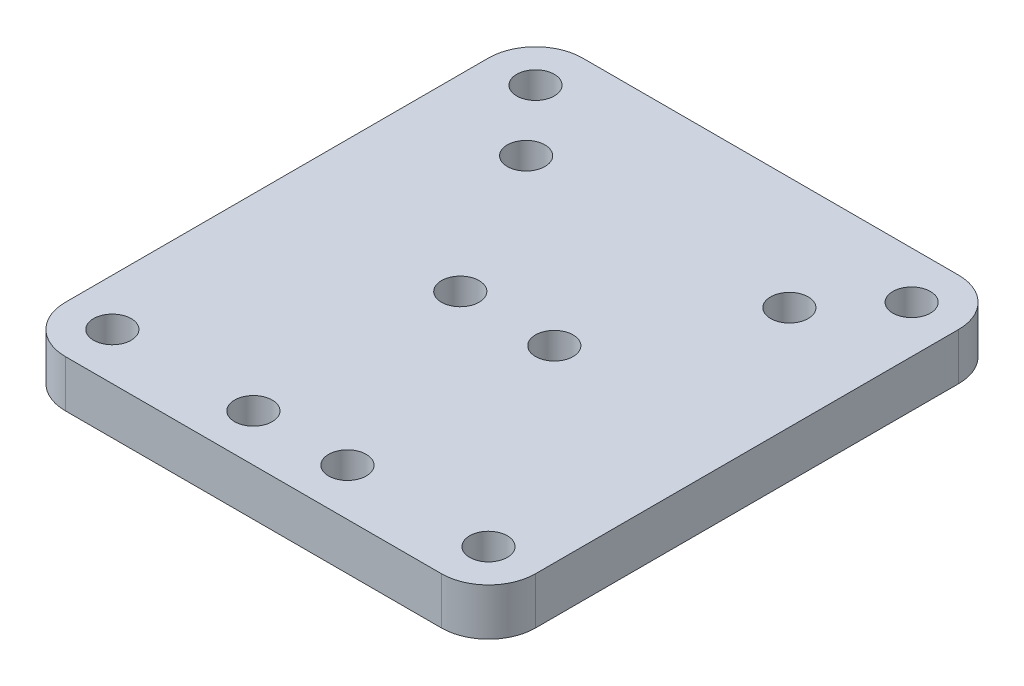
ISO-10303-21;
HEADER;
FILE_DESCRIPTION(('STEP AP214'),'2;1');
FILE_NAME('part.step','',(''),(''),'','','');
FILE_SCHEMA(('AUTOMOTIVE_DESIGN { 1 0 10303 214 1 1 1 1 }'));
ENDSEC;
DATA;
#1=APPLICATION_CONTEXT('core data for automotive mechanical design processes');
#2=APPLICATION_PROTOCOL_DEFINITION('international standard','automotive_design',2000,#1);
#3=PRODUCT_CONTEXT('',#1,'mechanical');
#4=PRODUCT('Part','Part','',(#3));
#5=PRODUCT_RELATED_PRODUCT_CATEGORY('part','',(#4));
#6=PRODUCT_DEFINITION_FORMATION('','',#4);
#7=PRODUCT_DEFINITION_CONTEXT('part definition',#1,'design');
#8=PRODUCT_DEFINITION('design','',#6,#7);
#9=PRODUCT_DEFINITION_SHAPE('','',#8);
#10=(LENGTH_UNIT() NAMED_UNIT(*) SI_UNIT(.MILLI.,.METRE.));
#11=(NAMED_UNIT(*) PLANE_ANGLE_UNIT() SI_UNIT($,.RADIAN.));
#12=(NAMED_UNIT(*) SI_UNIT($,.STERADIAN.) SOLID_ANGLE_UNIT());
#13=UNCERTAINTY_MEASURE_WITH_UNIT(LENGTH_MEASURE(1.E-05),#10,'distance_accuracy_value','');
#14=(GEOMETRIC_REPRESENTATION_CONTEXT(3) GLOBAL_UNCERTAINTY_ASSIGNED_CONTEXT((#13)) GLOBAL_UNIT_ASSIGNED_CONTEXT((#10,
#11,#12)) REPRESENTATION_CONTEXT('',''));
#15=CARTESIAN_POINT('',(0.,0.,0.));
#16=DIRECTION('',(0.,0.,1.));
#17=DIRECTION('',(1.,0.,0.));
#18=AXIS2_PLACEMENT_3D('',#15,#16,#17);
#19=CARTESIAN_POINT('',(0.,5.,0.));
#20=DIRECTION('',(0.,1.,0.));
#21=DIRECTION('',(0.,0.,1.));
#22=AXIS2_PLACEMENT_3D('',#19,#20,#21);
#23=PLANE('',#22);
#24=CARTESIAN_POINT('',(-20.,5.,22.5));
#25=DIRECTION('',(0.,1.,0.));
#26=DIRECTION('',(0.,0.,1.));
#27=AXIS2_PLACEMENT_3D('',#24,#25,#26);
#28=CIRCLE('',#27,2.);
#29=CARTESIAN_POINT('',(-20.,5.,24.5));
#30=VERTEX_POINT('',#29);
#31=EDGE_CURVE('E464',#30,#30,#28,.T.);
#32=ORIENTED_EDGE('',*,*,#31,.F.);
#33=EDGE_LOOP('',(#32));
#34=FACE_BOUND('',#33,.T.);
#35=CARTESIAN_POINT('',(20.,5.,22.5));
#36=DIRECTION('',(0.,1.,0.));
#37=DIRECTION('',(0.,0.,1.));
#38=AXIS2_PLACEMENT_3D('',#35,#36,#37);
#39=CIRCLE('',#38,2.);
#40=CARTESIAN_POINT('',(20.,5.,24.5));
#41=VERTEX_POINT('',#40);
#42=EDGE_CURVE('E466',#41,#41,#39,.T.);
#43=ORIENTED_EDGE('',*,*,#42,.F.);
#44=EDGE_LOOP('',(#43));
#45=FACE_BOUND('',#44,.T.);
#46=CARTESIAN_POINT('',(20.,5.,-22.5));
#47=DIRECTION('',(0.,1.,0.));
#48=DIRECTION('',(0.,0.,1.));
#49=AXIS2_PLACEMENT_3D('',#46,#47,#48);
#50=CIRCLE('',#49,2.);
#51=CARTESIAN_POINT('',(20.,5.,-20.5));
#52=VERTEX_POINT('',#51);
#53=EDGE_CURVE('E472',#52,#52,#50,.T.);
#54=ORIENTED_EDGE('',*,*,#53,.F.);
#55=EDGE_LOOP('',(#54));
#56=FACE_BOUND('',#55,.T.);
#57=CARTESIAN_POINT('',(14.,5.,-15.5));
#58=DIRECTION('',(0.,1.,0.));
#59=DIRECTION('',(0.,0.,1.));
#60=AXIS2_PLACEMENT_3D('',#57,#58,#59);
#61=CIRCLE('',#60,2.00000000000001);
#62=CARTESIAN_POINT('',(14.,5.,-13.5));
#63=VERTEX_POINT('',#62);
#64=EDGE_CURVE('E480',#63,#63,#61,.T.);
#65=ORIENTED_EDGE('',*,*,#64,.F.);
#66=EDGE_LOOP('',(#65));
#67=FACE_BOUND('',#66,.T.);
#68=CARTESIAN_POINT('',(-14.,5.,-15.5));
#69=DIRECTION('',(0.,1.,0.));
#70=DIRECTION('',(0.,0.,1.));
#71=AXIS2_PLACEMENT_3D('',#68,#69,#70);
#72=CIRCLE('',#71,2.);
#73=CARTESIAN_POINT('',(-14.,5.,-13.5));
#74=VERTEX_POINT('',#73);
#75=EDGE_CURVE('E475',#74,#74,#72,.T.);
#76=ORIENTED_EDGE('',*,*,#75,.F.);
#77=EDGE_LOOP('',(#76));
#78=FACE_BOUND('',#77,.T.);
#79=CARTESIAN_POINT('',(-20.,5.,-22.5));
#80=DIRECTION('',(0.,1.,0.));
#81=DIRECTION('',(0.,0.,1.));
#82=AXIS2_PLACEMENT_3D('',#79,#80,#81);
#83=CIRCLE('',#82,2.);
#84=CARTESIAN_POINT('',(-20.,5.,-20.5));
#85=VERTEX_POINT('',#84);
#86=EDGE_CURVE('E188',#85,#85,#83,.T.);
#87=ORIENTED_EDGE('',*,*,#86,.F.);
#88=EDGE_LOOP('',(#87));
#89=FACE_BOUND('',#88,.T.);
#90=CARTESIAN_POINT('',(-4.99999999999999,5.,0.499999999999997));
#91=DIRECTION('',(0.,1.,0.));
#92=DIRECTION('',(0.,0.,1.));
#93=AXIS2_PLACEMENT_3D('',#90,#91,#92);
#94=CIRCLE('',#93,2.);
#95=CARTESIAN_POINT('',(-4.99999999999999,5.,2.5));
#96=VERTEX_POINT('',#95);
#97=EDGE_CURVE('E221',#96,#96,#94,.T.);
#98=ORIENTED_EDGE('',*,*,#97,.F.);
#99=EDGE_LOOP('',(#98));
#100=FACE_BOUND('',#99,.T.);
#101=CARTESIAN_POINT('',(-4.99999999999999,5.,22.5));
#102=DIRECTION('',(0.,1.,0.));
#103=DIRECTION('',(0.,0.,1.));
#104=AXIS2_PLACEMENT_3D('',#101,#102,#103);
#105=CIRCLE('',#104,2.);
#106=CARTESIAN_POINT('',(-4.99999999999999,5.,24.5));
#107=VERTEX_POINT('',#106);
#108=EDGE_CURVE('E237',#107,#107,#105,.T.);
#109=ORIENTED_EDGE('',*,*,#108,.F.);
#110=EDGE_LOOP('',(#109));
#111=FACE_BOUND('',#110,.T.);
#112=DIRECTION('',(1.,0.,0.));
#113=VECTOR('',#112,1.);
#114=CARTESIAN_POINT('',(25.,5.,27.5));
#115=LINE('',#114,#113);
#116=CARTESIAN_POINT('',(-20.,5.,27.5));
#117=VERTEX_POINT('',#116);
#118=CARTESIAN_POINT('',(20.,5.,27.5));
#119=VERTEX_POINT('',#118);
#120=EDGE_CURVE('E247',#117,#119,#115,.T.);
#121=ORIENTED_EDGE('',*,*,#120,.T.);
#122=CARTESIAN_POINT('',(20.,5.,22.5));
#123=DIRECTION('',(0.,1.,0.));
#124=DIRECTION('',(0.,0.,1.));
#125=AXIS2_PLACEMENT_3D('',#122,#123,#124);
#126=CIRCLE('',#125,5.);
#127=CARTESIAN_POINT('',(25.,5.,22.5));
#128=VERTEX_POINT('',#127);
#129=EDGE_CURVE('E171',#119,#128,#126,.T.);
#130=ORIENTED_EDGE('',*,*,#129,.T.);
#131=DIRECTION('',(0.,0.,-1.));
#132=VECTOR('',#131,1.);
#133=CARTESIAN_POINT('',(25.,5.,27.5));
#134=LINE('',#133,#132);
#135=CARTESIAN_POINT('',(25.,5.,-22.5));
#136=VERTEX_POINT('',#135);
#137=EDGE_CURVE('E128',#128,#136,#134,.T.);
#138=ORIENTED_EDGE('',*,*,#137,.T.);
#139=CARTESIAN_POINT('',(20.,5.,-22.5));
#140=DIRECTION('',(0.,1.,0.));
#141=DIRECTION('',(0.,0.,1.));
#142=AXIS2_PLACEMENT_3D('',#139,#140,#141);
#143=CIRCLE('',#142,5.);
#144=CARTESIAN_POINT('',(20.,5.,-27.5));
#145=VERTEX_POINT('',#144);
#146=EDGE_CURVE('E64',#136,#145,#143,.T.);
#147=ORIENTED_EDGE('',*,*,#146,.T.);
#148=DIRECTION('',(-1.,0.,0.));
#149=VECTOR('',#148,1.);
#150=CARTESIAN_POINT('',(25.,5.,-27.5));
#151=LINE('',#150,#149);
#152=CARTESIAN_POINT('',(-20.,5.,-27.5));
#153=VERTEX_POINT('',#152);
#154=EDGE_CURVE('E149',#145,#153,#151,.T.);
#155=ORIENTED_EDGE('',*,*,#154,.T.);
#156=CARTESIAN_POINT('',(-20.,5.,-22.5));
#157=DIRECTION('',(0.,1.,0.));
#158=DIRECTION('',(0.,0.,1.));
#159=AXIS2_PLACEMENT_3D('',#156,#157,#158);
#160=CIRCLE('',#159,5.);
#161=CARTESIAN_POINT('',(-25.,5.,-22.5));
#162=VERTEX_POINT('',#161);
#163=EDGE_CURVE('E163',#153,#162,#160,.T.);
#164=ORIENTED_EDGE('',*,*,#163,.T.);
#165=DIRECTION('',(0.,0.,1.));
#166=VECTOR('',#165,1.);
#167=CARTESIAN_POINT('',(-25.,5.,27.5));
#168=LINE('',#167,#166);
#169=CARTESIAN_POINT('',(-25.,5.,22.5));
#170=VERTEX_POINT('',#169);
#171=EDGE_CURVE('E142',#162,#170,#168,.T.);
#172=ORIENTED_EDGE('',*,*,#171,.T.);
#173=CARTESIAN_POINT('',(-20.,5.,22.5));
#174=DIRECTION('',(0.,1.,0.));
#175=DIRECTION('',(0.,0.,1.));
#176=AXIS2_PLACEMENT_3D('',#173,#174,#175);
#177=CIRCLE('',#176,5.);
#178=EDGE_CURVE('E166',#170,#117,#177,.T.);
#179=ORIENTED_EDGE('',*,*,#178,.T.);
#180=EDGE_LOOP('',(#121,#130,#138,#147,#155,#164,#172,#179));
#181=FACE_BOUND('',#180,.T.);
#182=CARTESIAN_POINT('',(5.00000000000001,5.,22.5));
#183=DIRECTION('',(0.,1.,0.));
#184=DIRECTION('',(0.,0.,1.));
#185=AXIS2_PLACEMENT_3D('',#182,#183,#184);
#186=CIRCLE('',#185,2.);
#187=CARTESIAN_POINT('',(5.00000000000001,5.,24.5));
#188=VERTEX_POINT('',#187);
#189=EDGE_CURVE('E229',#188,#188,#186,.T.);
#190=ORIENTED_EDGE('',*,*,#189,.F.);
#191=EDGE_LOOP('',(#190));
#192=FACE_BOUND('',#191,.T.);
#193=CARTESIAN_POINT('',(5.,5.,0.499999999999996));
#194=DIRECTION('',(0.,1.,0.));
#195=DIRECTION('',(0.,0.,1.));
#196=AXIS2_PLACEMENT_3D('',#193,#194,#195);
#197=CIRCLE('',#196,2.);
#198=CARTESIAN_POINT('',(5.,5.,2.5));
#199=VERTEX_POINT('',#198);
#200=EDGE_CURVE('E211',#199,#199,#197,.T.);
#201=ORIENTED_EDGE('',*,*,#200,.F.);
#202=EDGE_LOOP('',(#201));
#203=FACE_BOUND('',#202,.T.);
#204=ADVANCED_FACE('F39',(#34,#45,#56,#67,#78,#89,#100,#111,#181,#192,#203),#23,.T.);
#205=CARTESIAN_POINT('',(0.,0.,0.));
#206=DIRECTION('',(0.,1.,0.));
#207=DIRECTION('',(0.,0.,1.));
#208=AXIS2_PLACEMENT_3D('',#205,#206,#207);
#209=PLANE('',#208);
#210=CARTESIAN_POINT('',(-20.,0.,22.5));
#211=DIRECTION('',(0.,1.,0.));
#212=DIRECTION('',(0.,0.,1.));
#213=AXIS2_PLACEMENT_3D('',#210,#211,#212);
#214=CIRCLE('',#213,2.);
#215=CARTESIAN_POINT('',(-20.,0.,24.5));
#216=VERTEX_POINT('',#215);
#217=EDGE_CURVE('E43',#216,#216,#214,.T.);
#218=ORIENTED_EDGE('',*,*,#217,.T.);
#219=EDGE_LOOP('',(#218));
#220=FACE_BOUND('',#219,.T.);
#221=CARTESIAN_POINT('',(20.,0.,22.5));
#222=DIRECTION('',(0.,1.,0.));
#223=DIRECTION('',(0.,0.,1.));
#224=AXIS2_PLACEMENT_3D('',#221,#222,#223);
#225=CIRCLE('',#224,2.);
#226=CARTESIAN_POINT('',(20.,0.,24.5));
#227=VERTEX_POINT('',#226);
#228=EDGE_CURVE('E199',#227,#227,#225,.T.);
#229=ORIENTED_EDGE('',*,*,#228,.T.);
#230=EDGE_LOOP('',(#229));
#231=FACE_BOUND('',#230,.T.);
#232=CARTESIAN_POINT('',(20.,0.,-22.5));
#233=DIRECTION('',(0.,1.,0.));
#234=DIRECTION('',(0.,0.,1.));
#235=AXIS2_PLACEMENT_3D('',#232,#233,#234);
#236=CIRCLE('',#235,2.);
#237=CARTESIAN_POINT('',(20.,0.,-20.5));
#238=VERTEX_POINT('',#237);
#239=EDGE_CURVE('E196',#238,#238,#236,.T.);
#240=ORIENTED_EDGE('',*,*,#239,.T.);
#241=EDGE_LOOP('',(#240));
#242=FACE_BOUND('',#241,.T.);
#243=CARTESIAN_POINT('',(14.,0.,-15.5));
#244=DIRECTION('',(0.,1.,0.));
#245=DIRECTION('',(0.,0.,1.));
#246=AXIS2_PLACEMENT_3D('',#243,#244,#245);
#247=CIRCLE('',#246,2.00000000000001);
#248=CARTESIAN_POINT('',(14.,0.,-13.5));
#249=VERTEX_POINT('',#248);
#250=EDGE_CURVE('E192',#249,#249,#247,.T.);
#251=ORIENTED_EDGE('',*,*,#250,.T.);
#252=EDGE_LOOP('',(#251));
#253=FACE_BOUND('',#252,.T.);
#254=CARTESIAN_POINT('',(-14.,0.,-15.5));
#255=DIRECTION('',(0.,1.,0.));
#256=DIRECTION('',(0.,0.,1.));
#257=AXIS2_PLACEMENT_3D('',#254,#255,#256);
#258=CIRCLE('',#257,2.);
#259=CARTESIAN_POINT('',(-14.,0.,-13.5));
#260=VERTEX_POINT('',#259);
#261=EDGE_CURVE('E187',#260,#260,#258,.T.);
#262=ORIENTED_EDGE('',*,*,#261,.T.);
#263=EDGE_LOOP('',(#262));
#264=FACE_BOUND('',#263,.T.);
#265=CARTESIAN_POINT('',(-20.,0.,-22.5));
#266=DIRECTION('',(0.,1.,0.));
#267=DIRECTION('',(0.,0.,1.));
#268=AXIS2_PLACEMENT_3D('',#265,#266,#267);
#269=CIRCLE('',#268,2.);
#270=CARTESIAN_POINT('',(-20.,0.,-20.5));
#271=VERTEX_POINT('',#270);
#272=EDGE_CURVE('E183',#271,#271,#269,.T.);
#273=ORIENTED_EDGE('',*,*,#272,.T.);
#274=EDGE_LOOP('',(#273));
#275=FACE_BOUND('',#274,.T.);
#276=DIRECTION('',(0.,0.,-1.));
#277=VECTOR('',#276,1.);
#278=CARTESIAN_POINT('',(25.,0.,27.5));
#279=LINE('',#278,#277);
#280=CARTESIAN_POINT('',(25.,0.,22.5));
#281=VERTEX_POINT('',#280);
#282=CARTESIAN_POINT('',(25.,0.,-22.5));
#283=VERTEX_POINT('',#282);
#284=EDGE_CURVE('E126',#281,#283,#279,.T.);
#285=ORIENTED_EDGE('',*,*,#284,.F.);
#286=CARTESIAN_POINT('',(20.,0.,22.5));
#287=DIRECTION('',(0.,1.,0.));
#288=DIRECTION('',(0.,0.,1.));
#289=AXIS2_PLACEMENT_3D('',#286,#287,#288);
#290=CIRCLE('',#289,5.);
#291=CARTESIAN_POINT('',(20.,0.,27.5));
#292=VERTEX_POINT('',#291);
#293=EDGE_CURVE('E108',#281,#292,#290,.F.);
#294=ORIENTED_EDGE('',*,*,#293,.T.);
#295=DIRECTION('',(1.,0.,0.));
#296=VECTOR('',#295,1.);
#297=CARTESIAN_POINT('',(25.,0.,27.5));
#298=LINE('',#297,#296);
#299=CARTESIAN_POINT('',(-20.,0.,27.5));
#300=VERTEX_POINT('',#299);
#301=EDGE_CURVE('E138',#300,#292,#298,.T.);
#302=ORIENTED_EDGE('',*,*,#301,.F.);
#303=CARTESIAN_POINT('',(-20.,0.,22.5));
#304=DIRECTION('',(0.,1.,0.));
#305=DIRECTION('',(0.,0.,1.));
#306=AXIS2_PLACEMENT_3D('',#303,#304,#305);
#307=CIRCLE('',#306,5.);
#308=CARTESIAN_POINT('',(-25.,0.,22.5));
#309=VERTEX_POINT('',#308);
#310=EDGE_CURVE('E153',#300,#309,#307,.F.);
#311=ORIENTED_EDGE('',*,*,#310,.T.);
#312=DIRECTION('',(0.,0.,1.));
#313=VECTOR('',#312,1.);
#314=CARTESIAN_POINT('',(-25.,0.,27.5));
#315=LINE('',#314,#313);
#316=CARTESIAN_POINT('',(-25.,0.,-22.5));
#317=VERTEX_POINT('',#316);
#318=EDGE_CURVE('E144',#317,#309,#315,.T.);
#319=ORIENTED_EDGE('',*,*,#318,.F.);
#320=CARTESIAN_POINT('',(-20.,0.,-22.5));
#321=DIRECTION('',(0.,1.,0.));
#322=DIRECTION('',(0.,0.,1.));
#323=AXIS2_PLACEMENT_3D('',#320,#321,#322);
#324=CIRCLE('',#323,5.);
#325=CARTESIAN_POINT('',(-20.,0.,-27.5));
#326=VERTEX_POINT('',#325);
#327=EDGE_CURVE('E130',#317,#326,#324,.F.);
#328=ORIENTED_EDGE('',*,*,#327,.T.);
#329=DIRECTION('',(-1.,0.,0.));
#330=VECTOR('',#329,1.);
#331=CARTESIAN_POINT('',(25.,0.,-27.5));
#332=LINE('',#331,#330);
#333=CARTESIAN_POINT('',(20.,0.,-27.5));
#334=VERTEX_POINT('',#333);
#335=EDGE_CURVE('E137',#334,#326,#332,.T.);
#336=ORIENTED_EDGE('',*,*,#335,.F.);
#337=CARTESIAN_POINT('',(20.,0.,-22.5));
#338=DIRECTION('',(0.,1.,0.));
#339=DIRECTION('',(0.,0.,1.));
#340=AXIS2_PLACEMENT_3D('',#337,#338,#339);
#341=CIRCLE('',#340,5.);
#342=EDGE_CURVE('E120',#334,#283,#341,.F.);
#343=ORIENTED_EDGE('',*,*,#342,.T.);
#344=EDGE_LOOP('',(#285,#294,#302,#311,#319,#328,#336,#343));
#345=FACE_BOUND('',#344,.T.);
#346=CARTESIAN_POINT('',(-4.99999999999999,0.,22.5));
#347=DIRECTION('',(0.,1.,0.));
#348=DIRECTION('',(0.,0.,1.));
#349=AXIS2_PLACEMENT_3D('',#346,#347,#348);
#350=CIRCLE('',#349,2.);
#351=CARTESIAN_POINT('',(-4.99999999999999,0.,24.5));
#352=VERTEX_POINT('',#351);
#353=EDGE_CURVE('E233',#352,#352,#350,.T.);
#354=ORIENTED_EDGE('',*,*,#353,.T.);
#355=EDGE_LOOP('',(#354));
#356=FACE_BOUND('',#355,.T.);
#357=CARTESIAN_POINT('',(5.00000000000001,0.,22.5));
#358=DIRECTION('',(0.,1.,0.));
#359=DIRECTION('',(0.,0.,1.));
#360=AXIS2_PLACEMENT_3D('',#357,#358,#359);
#361=CIRCLE('',#360,2.);
#362=CARTESIAN_POINT('',(5.00000000000001,0.,24.5));
#363=VERTEX_POINT('',#362);
#364=EDGE_CURVE('E225',#363,#363,#361,.T.);
#365=ORIENTED_EDGE('',*,*,#364,.T.);
#366=EDGE_LOOP('',(#365));
#367=FACE_BOUND('',#366,.T.);
#368=CARTESIAN_POINT('',(-4.99999999999999,0.,0.499999999999997));
#369=DIRECTION('',(0.,1.,0.));
#370=DIRECTION('',(0.,0.,1.));
#371=AXIS2_PLACEMENT_3D('',#368,#369,#370);
#372=CIRCLE('',#371,2.);
#373=CARTESIAN_POINT('',(-4.99999999999999,0.,2.5));
#374=VERTEX_POINT('',#373);
#375=EDGE_CURVE('E217',#374,#374,#372,.T.);
#376=ORIENTED_EDGE('',*,*,#375,.T.);
#377=EDGE_LOOP('',(#376));
#378=FACE_BOUND('',#377,.T.);
#379=CARTESIAN_POINT('',(5.,0.,0.499999999999996));
#380=DIRECTION('',(0.,1.,0.));
#381=DIRECTION('',(0.,0.,1.));
#382=AXIS2_PLACEMENT_3D('',#379,#380,#381);
#383=CIRCLE('',#382,2.);
#384=CARTESIAN_POINT('',(5.,0.,2.5));
#385=VERTEX_POINT('',#384);
#386=EDGE_CURVE('E206',#385,#385,#383,.T.);
#387=ORIENTED_EDGE('',*,*,#386,.T.);
#388=EDGE_LOOP('',(#387));
#389=FACE_BOUND('',#388,.T.);
#390=ADVANCED_FACE('F133',(#220,#231,#242,#253,#264,#275,#345,#356,#367,#378,#389),#209,.F.);
#391=CARTESIAN_POINT('',(-25.,5.,27.5));
#392=DIRECTION('',(1.,0.,0.));
#393=DIRECTION('',(0.,0.,-1.));
#394=AXIS2_PLACEMENT_3D('',#391,#392,#393);
#395=PLANE('',#394);
#396=ORIENTED_EDGE('',*,*,#318,.T.);
#397=DIRECTION('',(0.,-1.,0.));
#398=VECTOR('',#397,1.);
#399=CARTESIAN_POINT('',(-25.,5.,22.5));
#400=LINE('',#399,#398);
#401=EDGE_CURVE('E11',#309,#170,#400,.F.);
#402=ORIENTED_EDGE('',*,*,#401,.T.);
#403=ORIENTED_EDGE('',*,*,#171,.F.);
#404=DIRECTION('',(0.,-1.,0.));
#405=VECTOR('',#404,1.);
#406=CARTESIAN_POINT('',(-25.,5.,-22.5));
#407=LINE('',#406,#405);
#408=EDGE_CURVE('E49',#162,#317,#407,.T.);
#409=ORIENTED_EDGE('',*,*,#408,.T.);
#410=EDGE_LOOP('',(#396,#402,#403,#409));
#411=FACE_BOUND('',#410,.T.);
#412=ADVANCED_FACE('F259',(#411),#395,.F.);
#413=CARTESIAN_POINT('',(25.,5.,27.5));
#414=DIRECTION('',(0.,0.,-1.));
#415=DIRECTION('',(-1.,0.,0.));
#416=AXIS2_PLACEMENT_3D('',#413,#414,#415);
#417=PLANE('',#416);
#418=ORIENTED_EDGE('',*,*,#301,.T.);
#419=DIRECTION('',(0.,-1.,0.));
#420=VECTOR('',#419,1.);
#421=CARTESIAN_POINT('',(20.,5.,27.5));
#422=LINE('',#421,#420);
#423=EDGE_CURVE('E113',#292,#119,#422,.F.);
#424=ORIENTED_EDGE('',*,*,#423,.T.);
#425=ORIENTED_EDGE('',*,*,#120,.F.);
#426=DIRECTION('',(0.,-1.,0.));
#427=VECTOR('',#426,1.);
#428=CARTESIAN_POINT('',(-20.,5.,27.5));
#429=LINE('',#428,#427);
#430=EDGE_CURVE('E119',#117,#300,#429,.T.);
#431=ORIENTED_EDGE('',*,*,#430,.T.);
#432=EDGE_LOOP('',(#418,#424,#425,#431));
#433=FACE_BOUND('',#432,.T.);
#434=ADVANCED_FACE('F269',(#433),#417,.F.);
#435=CARTESIAN_POINT('',(25.,5.,27.5));
#436=DIRECTION('',(-1.,0.,0.));
#437=DIRECTION('',(0.,0.,1.));
#438=AXIS2_PLACEMENT_3D('',#435,#436,#437);
#439=PLANE('',#438);
#440=ORIENTED_EDGE('',*,*,#137,.F.);
#441=DIRECTION('',(0.,-1.,0.));
#442=VECTOR('',#441,1.);
#443=CARTESIAN_POINT('',(25.,5.,22.5));
#444=LINE('',#443,#442);
#445=EDGE_CURVE('E112',#128,#281,#444,.T.);
#446=ORIENTED_EDGE('',*,*,#445,.T.);
#447=ORIENTED_EDGE('',*,*,#284,.T.);
#448=DIRECTION('',(0.,-1.,0.));
#449=VECTOR('',#448,1.);
#450=CARTESIAN_POINT('',(25.,5.,-22.5));
#451=LINE('',#450,#449);
#452=EDGE_CURVE('E131',#283,#136,#451,.F.);
#453=ORIENTED_EDGE('',*,*,#452,.T.);
#454=EDGE_LOOP('',(#440,#446,#447,#453));
#455=FACE_BOUND('',#454,.T.);
#456=ADVANCED_FACE('F125',(#455),#439,.F.);
#457=CARTESIAN_POINT('',(25.,5.,-27.5));
#458=DIRECTION('',(0.,0.,1.));
#459=DIRECTION('',(1.,0.,0.));
#460=AXIS2_PLACEMENT_3D('',#457,#458,#459);
#461=PLANE('',#460);
#462=ORIENTED_EDGE('',*,*,#154,.F.);
#463=DIRECTION('',(0.,-1.,0.));
#464=VECTOR('',#463,1.);
#465=CARTESIAN_POINT('',(20.,5.,-27.5));
#466=LINE('',#465,#464);
#467=EDGE_CURVE('E176',#145,#334,#466,.T.);
#468=ORIENTED_EDGE('',*,*,#467,.T.);
#469=ORIENTED_EDGE('',*,*,#335,.T.);
#470=DIRECTION('',(0.,-1.,0.));
#471=VECTOR('',#470,1.);
#472=CARTESIAN_POINT('',(-20.,5.,-27.5));
#473=LINE('',#472,#471);
#474=EDGE_CURVE('E57',#326,#153,#473,.F.);
#475=ORIENTED_EDGE('',*,*,#474,.T.);
#476=EDGE_LOOP('',(#462,#468,#469,#475));
#477=FACE_BOUND('',#476,.T.);
#478=ADVANCED_FACE('F276',(#477),#461,.F.);
#479=CARTESIAN_POINT('',(-4.99999999999999,5.,22.5));
#480=DIRECTION('',(0.,-1.,0.));
#481=DIRECTION('',(0.,0.,-1.));
#482=AXIS2_PLACEMENT_3D('',#479,#480,#481);
#483=CYLINDRICAL_SURFACE('',#482,2.);
#484=ORIENTED_EDGE('',*,*,#108,.T.);
#485=EDGE_LOOP('',(#484));
#486=FACE_BOUND('',#485,.T.);
#487=ORIENTED_EDGE('',*,*,#353,.F.);
#488=EDGE_LOOP('',(#487));
#489=FACE_BOUND('',#488,.T.);
#490=ADVANCED_FACE('F289',(#486,#489),#483,.F.);
#491=CARTESIAN_POINT('',(5.00000000000001,5.,22.5));
#492=DIRECTION('',(0.,-1.,0.));
#493=DIRECTION('',(0.,0.,-1.));
#494=AXIS2_PLACEMENT_3D('',#491,#492,#493);
#495=CYLINDRICAL_SURFACE('',#494,2.);
#496=ORIENTED_EDGE('',*,*,#189,.T.);
#497=EDGE_LOOP('',(#496));
#498=FACE_BOUND('',#497,.T.);
#499=ORIENTED_EDGE('',*,*,#364,.F.);
#500=EDGE_LOOP('',(#499));
#501=FACE_BOUND('',#500,.T.);
#502=ADVANCED_FACE('F296',(#498,#501),#495,.F.);
#503=CARTESIAN_POINT('',(-4.99999999999999,5.,0.499999999999997));
#504=DIRECTION('',(0.,-1.,0.));
#505=DIRECTION('',(0.,0.,-1.));
#506=AXIS2_PLACEMENT_3D('',#503,#504,#505);
#507=CYLINDRICAL_SURFACE('',#506,2.);
#508=ORIENTED_EDGE('',*,*,#97,.T.);
#509=EDGE_LOOP('',(#508));
#510=FACE_BOUND('',#509,.T.);
#511=ORIENTED_EDGE('',*,*,#375,.F.);
#512=EDGE_LOOP('',(#511));
#513=FACE_BOUND('',#512,.T.);
#514=ADVANCED_FACE('F313',(#510,#513),#507,.F.);
#515=CARTESIAN_POINT('',(5.,5.,0.499999999999996));
#516=DIRECTION('',(0.,-1.,0.));
#517=DIRECTION('',(0.,0.,-1.));
#518=AXIS2_PLACEMENT_3D('',#515,#516,#517);
#519=CYLINDRICAL_SURFACE('',#518,2.);
#520=ORIENTED_EDGE('',*,*,#200,.T.);
#521=EDGE_LOOP('',(#520));
#522=FACE_BOUND('',#521,.T.);
#523=ORIENTED_EDGE('',*,*,#386,.F.);
#524=EDGE_LOOP('',(#523));
#525=FACE_BOUND('',#524,.T.);
#526=ADVANCED_FACE('F308',(#522,#525),#519,.F.);
#527=CARTESIAN_POINT('',(20.,5.,22.5));
#528=DIRECTION('',(0.,-1.,0.));
#529=DIRECTION('',(0.,0.,-1.));
#530=AXIS2_PLACEMENT_3D('',#527,#528,#529);
#531=CYLINDRICAL_SURFACE('',#530,5.);
#532=ORIENTED_EDGE('',*,*,#129,.F.);
#533=ORIENTED_EDGE('',*,*,#423,.F.);
#534=ORIENTED_EDGE('',*,*,#293,.F.);
#535=ORIENTED_EDGE('',*,*,#445,.F.);
#536=EDGE_LOOP('',(#532,#533,#534,#535));
#537=FACE_BOUND('',#536,.T.);
#538=ADVANCED_FACE('F111',(#537),#531,.T.);
#539=CARTESIAN_POINT('',(20.,5.,-22.5));
#540=DIRECTION('',(0.,-1.,0.));
#541=DIRECTION('',(0.,0.,-1.));
#542=AXIS2_PLACEMENT_3D('',#539,#540,#541);
#543=CYLINDRICAL_SURFACE('',#542,5.);
#544=ORIENTED_EDGE('',*,*,#146,.F.);
#545=ORIENTED_EDGE('',*,*,#452,.F.);
#546=ORIENTED_EDGE('',*,*,#342,.F.);
#547=ORIENTED_EDGE('',*,*,#467,.F.);
#548=EDGE_LOOP('',(#544,#545,#546,#547));
#549=FACE_BOUND('',#548,.T.);
#550=ADVANCED_FACE('F301',(#549),#543,.T.);
#551=CARTESIAN_POINT('',(-20.,5.,22.5));
#552=DIRECTION('',(0.,-1.,0.));
#553=DIRECTION('',(0.,0.,-1.));
#554=AXIS2_PLACEMENT_3D('',#551,#552,#553);
#555=CYLINDRICAL_SURFACE('',#554,5.);
#556=ORIENTED_EDGE('',*,*,#178,.F.);
#557=ORIENTED_EDGE('',*,*,#401,.F.);
#558=ORIENTED_EDGE('',*,*,#310,.F.);
#559=ORIENTED_EDGE('',*,*,#430,.F.);
#560=EDGE_LOOP('',(#556,#557,#558,#559));
#561=FACE_BOUND('',#560,.T.);
#562=ADVANCED_FACE('F264',(#561),#555,.T.);
#563=CARTESIAN_POINT('',(-20.,5.,-22.5));
#564=DIRECTION('',(0.,-1.,0.));
#565=DIRECTION('',(0.,0.,-1.));
#566=AXIS2_PLACEMENT_3D('',#563,#564,#565);
#567=CYLINDRICAL_SURFACE('',#566,5.);
#568=ORIENTED_EDGE('',*,*,#163,.F.);
#569=ORIENTED_EDGE('',*,*,#474,.F.);
#570=ORIENTED_EDGE('',*,*,#327,.F.);
#571=ORIENTED_EDGE('',*,*,#408,.F.);
#572=EDGE_LOOP('',(#568,#569,#570,#571));
#573=FACE_BOUND('',#572,.T.);
#574=ADVANCED_FACE('F41',(#573),#567,.T.);
#575=CARTESIAN_POINT('',(-20.,-5.,-22.5));
#576=DIRECTION('',(0.,1.,0.));
#577=DIRECTION('',(0.,0.,1.));
#578=AXIS2_PLACEMENT_3D('',#575,#576,#577);
#579=CYLINDRICAL_SURFACE('',#578,2.);
#580=ORIENTED_EDGE('',*,*,#86,.T.);
#581=EDGE_LOOP('',(#580));
#582=FACE_BOUND('',#581,.T.);
#583=ORIENTED_EDGE('',*,*,#272,.F.);
#584=EDGE_LOOP('',(#583));
#585=FACE_BOUND('',#584,.T.);
#586=ADVANCED_FACE('F323',(#582,#585),#579,.F.);
#587=CARTESIAN_POINT('',(-14.,-5.,-15.5));
#588=DIRECTION('',(0.,1.,0.));
#589=DIRECTION('',(0.,0.,1.));
#590=AXIS2_PLACEMENT_3D('',#587,#588,#589);
#591=CYLINDRICAL_SURFACE('',#590,2.);
#592=ORIENTED_EDGE('',*,*,#75,.T.);
#593=EDGE_LOOP('',(#592));
#594=FACE_BOUND('',#593,.T.);
#595=ORIENTED_EDGE('',*,*,#261,.F.);
#596=EDGE_LOOP('',(#595));
#597=FACE_BOUND('',#596,.T.);
#598=ADVANCED_FACE('F410',(#594,#597),#591,.F.);
#599=CARTESIAN_POINT('',(14.,-5.,-15.5));
#600=DIRECTION('',(0.,1.,0.));
#601=DIRECTION('',(0.,0.,1.));
#602=AXIS2_PLACEMENT_3D('',#599,#600,#601);
#603=CYLINDRICAL_SURFACE('',#602,2.00000000000001);
#604=ORIENTED_EDGE('',*,*,#64,.T.);
#605=EDGE_LOOP('',(#604));
#606=FACE_BOUND('',#605,.T.);
#607=ORIENTED_EDGE('',*,*,#250,.F.);
#608=EDGE_LOOP('',(#607));
#609=FACE_BOUND('',#608,.T.);
#610=ADVANCED_FACE('F419',(#606,#609),#603,.F.);
#611=CARTESIAN_POINT('',(20.,-5.,-22.5));
#612=DIRECTION('',(0.,1.,0.));
#613=DIRECTION('',(0.,0.,1.));
#614=AXIS2_PLACEMENT_3D('',#611,#612,#613);
#615=CYLINDRICAL_SURFACE('',#614,2.);
#616=ORIENTED_EDGE('',*,*,#53,.T.);
#617=EDGE_LOOP('',(#616));
#618=FACE_BOUND('',#617,.T.);
#619=ORIENTED_EDGE('',*,*,#239,.F.);
#620=EDGE_LOOP('',(#619));
#621=FACE_BOUND('',#620,.T.);
#622=ADVANCED_FACE('F429',(#618,#621),#615,.F.);
#623=CARTESIAN_POINT('',(20.,-5.,22.5));
#624=DIRECTION('',(0.,1.,0.));
#625=DIRECTION('',(0.,0.,1.));
#626=AXIS2_PLACEMENT_3D('',#623,#624,#625);
#627=CYLINDRICAL_SURFACE('',#626,2.);
#628=ORIENTED_EDGE('',*,*,#42,.T.);
#629=EDGE_LOOP('',(#628));
#630=FACE_BOUND('',#629,.T.);
#631=ORIENTED_EDGE('',*,*,#228,.F.);
#632=EDGE_LOOP('',(#631));
#633=FACE_BOUND('',#632,.T.);
#634=ADVANCED_FACE('F438',(#630,#633),#627,.F.);
#635=CARTESIAN_POINT('',(-20.,-5.,22.5));
#636=DIRECTION('',(0.,1.,0.));
#637=DIRECTION('',(0.,0.,1.));
#638=AXIS2_PLACEMENT_3D('',#635,#636,#637);
#639=CYLINDRICAL_SURFACE('',#638,2.);
#640=ORIENTED_EDGE('',*,*,#31,.T.);
#641=EDGE_LOOP('',(#640));
#642=FACE_BOUND('',#641,.T.);
#643=ORIENTED_EDGE('',*,*,#217,.F.);
#644=EDGE_LOOP('',(#643));
#645=FACE_BOUND('',#644,.T.);
#646=ADVANCED_FACE('F448',(#642,#645),#639,.F.);
#647=CLOSED_SHELL('',(#204,#390,#412,#434,#456,#478,#490,#502,#514,#526,#538,#550,#562,#574,
#586,#598,#610,#622,#634,#646));
#648=MANIFOLD_SOLID_BREP('B2',#647);
#649=ADVANCED_BREP_SHAPE_REPRESENTATION('',(#18,#648),#14);
#650=SHAPE_DEFINITION_REPRESENTATION(#9,#649);
ENDSEC;
END-ISO-10303-21;
